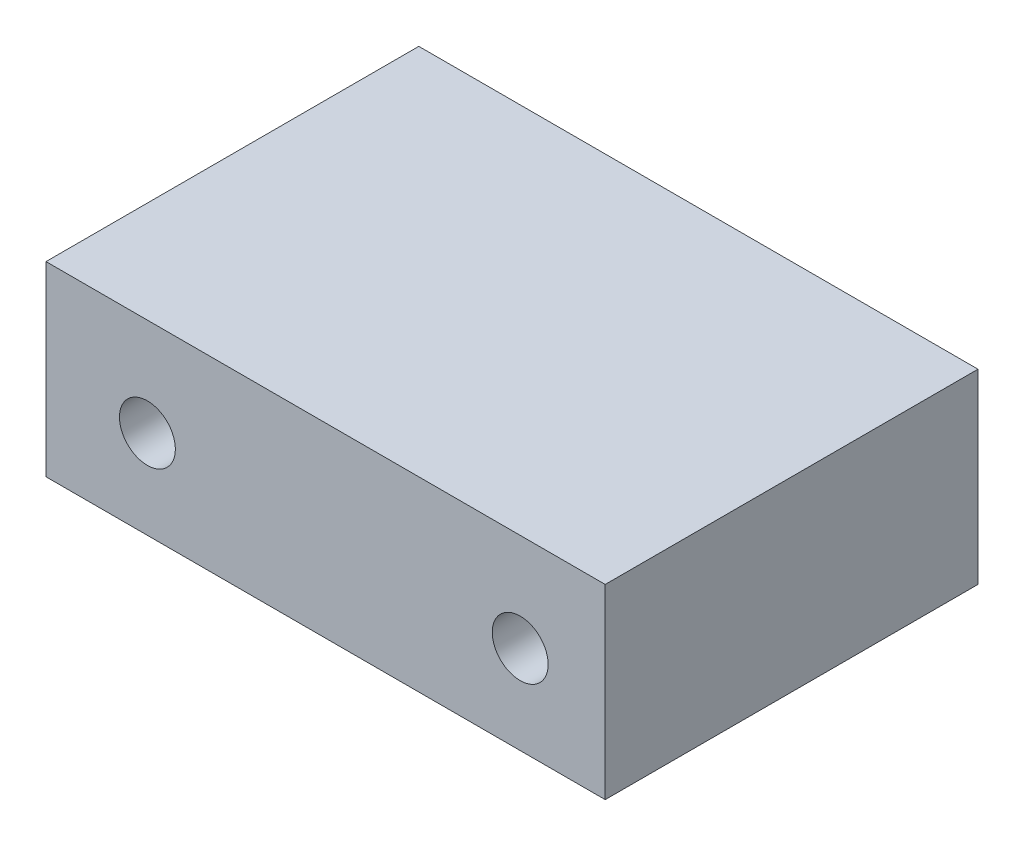
ISO-10303-21;
HEADER;
FILE_DESCRIPTION(('STEP AP214'),'2;1');
FILE_NAME('part.step','',(''),(''),'','','');
FILE_SCHEMA(('AUTOMOTIVE_DESIGN { 1 0 10303 214 1 1 1 1 }'));
ENDSEC;
DATA;
#1=APPLICATION_CONTEXT('core data for automotive mechanical design processes');
#2=APPLICATION_PROTOCOL_DEFINITION('international standard','automotive_design',2000,#1);
#3=PRODUCT_CONTEXT('',#1,'mechanical');
#4=PRODUCT('Part','Part','',(#3));
#5=PRODUCT_RELATED_PRODUCT_CATEGORY('part','',(#4));
#6=PRODUCT_DEFINITION_FORMATION('','',#4);
#7=PRODUCT_DEFINITION_CONTEXT('part definition',#1,'design');
#8=PRODUCT_DEFINITION('design','',#6,#7);
#9=PRODUCT_DEFINITION_SHAPE('','',#8);
#10=(LENGTH_UNIT() NAMED_UNIT(*) SI_UNIT(.MILLI.,.METRE.));
#11=(NAMED_UNIT(*) PLANE_ANGLE_UNIT() SI_UNIT($,.RADIAN.));
#12=(NAMED_UNIT(*) SI_UNIT($,.STERADIAN.) SOLID_ANGLE_UNIT());
#13=UNCERTAINTY_MEASURE_WITH_UNIT(LENGTH_MEASURE(1.E-05),#10,'distance_accuracy_value','');
#14=(GEOMETRIC_REPRESENTATION_CONTEXT(3) GLOBAL_UNCERTAINTY_ASSIGNED_CONTEXT((#13)) GLOBAL_UNIT_ASSIGNED_CONTEXT((#10,
#11,#12)) REPRESENTATION_CONTEXT('',''));
#15=CARTESIAN_POINT('',(0.,0.,0.));
#16=DIRECTION('',(0.,0.,1.));
#17=DIRECTION('',(1.,0.,0.));
#18=AXIS2_PLACEMENT_3D('',#15,#16,#17);
#19=CARTESIAN_POINT('',(15.,10.,10.));
#20=DIRECTION('',(-1.,0.,0.));
#21=DIRECTION('',(0.,0.,1.));
#22=AXIS2_PLACEMENT_3D('',#19,#20,#21);
#23=PLANE('',#22);
#24=DIRECTION('',(0.,0.,-1.));
#25=VECTOR('',#24,1.);
#26=CARTESIAN_POINT('',(15.,0.,10.));
#27=LINE('',#26,#25);
#28=CARTESIAN_POINT('',(15.,0.,10.));
#29=VERTEX_POINT('',#28);
#30=CARTESIAN_POINT('',(15.,0.,-10.));
#31=VERTEX_POINT('',#30);
#32=EDGE_CURVE('E111',#29,#31,#27,.T.);
#33=ORIENTED_EDGE('',*,*,#32,.T.);
#34=DIRECTION('',(0.,-1.,0.));
#35=VECTOR('',#34,1.);
#36=CARTESIAN_POINT('',(15.,10.,-10.));
#37=LINE('',#36,#35);
#38=CARTESIAN_POINT('',(15.,10.,-10.));
#39=VERTEX_POINT('',#38);
#40=EDGE_CURVE('E11',#39,#31,#37,.T.);
#41=ORIENTED_EDGE('',*,*,#40,.F.);
#42=DIRECTION('',(0.,0.,-1.));
#43=VECTOR('',#42,1.);
#44=CARTESIAN_POINT('',(15.,10.,10.));
#45=LINE('',#44,#43);
#46=CARTESIAN_POINT('',(15.,10.,10.));
#47=VERTEX_POINT('',#46);
#48=EDGE_CURVE('E95',#47,#39,#45,.T.);
#49=ORIENTED_EDGE('',*,*,#48,.F.);
#50=DIRECTION('',(0.,-1.,0.));
#51=VECTOR('',#50,1.);
#52=CARTESIAN_POINT('',(15.,10.,10.));
#53=LINE('',#52,#51);
#54=EDGE_CURVE('E107',#47,#29,#53,.T.);
#55=ORIENTED_EDGE('',*,*,#54,.T.);
#56=EDGE_LOOP('',(#33,#41,#49,#55));
#57=FACE_BOUND('',#56,.T.);
#58=ADVANCED_FACE('F43',(#57),#23,.F.);
#59=CARTESIAN_POINT('',(-15.,10.,-10.));
#60=DIRECTION('',(0.,0.,1.));
#61=DIRECTION('',(1.,0.,0.));
#62=AXIS2_PLACEMENT_3D('',#59,#60,#61);
#63=PLANE('',#62);
#64=CARTESIAN_POINT('',(-9.56010316882996,4.75000000000004,-10.));
#65=DIRECTION('',(0.,0.,1.));
#66=DIRECTION('',(1.,0.,0.));
#67=AXIS2_PLACEMENT_3D('',#64,#65,#66);
#68=CIRCLE('',#67,1.5);
#69=CARTESIAN_POINT('',(-8.06010316882996,4.75000000000004,-10.));
#70=VERTEX_POINT('',#69);
#71=EDGE_CURVE('E115',#70,#70,#68,.T.);
#72=ORIENTED_EDGE('',*,*,#71,.T.);
#73=EDGE_LOOP('',(#72));
#74=FACE_BOUND('',#73,.T.);
#75=CARTESIAN_POINT('',(10.43989683117,4.75000000000005,-10.));
#76=DIRECTION('',(0.,0.,1.));
#77=DIRECTION('',(1.,0.,0.));
#78=AXIS2_PLACEMENT_3D('',#75,#76,#77);
#79=CIRCLE('',#78,1.5);
#80=CARTESIAN_POINT('',(11.93989683117,4.75000000000005,-10.));
#81=VERTEX_POINT('',#80);
#82=EDGE_CURVE('E135',#81,#81,#79,.T.);
#83=ORIENTED_EDGE('',*,*,#82,.T.);
#84=EDGE_LOOP('',(#83));
#85=FACE_BOUND('',#84,.T.);
#86=DIRECTION('',(-1.,0.,0.));
#87=VECTOR('',#86,1.);
#88=CARTESIAN_POINT('',(-15.,0.,-10.));
#89=LINE('',#88,#87);
#90=CARTESIAN_POINT('',(-15.,0.,-10.));
#91=VERTEX_POINT('',#90);
#92=EDGE_CURVE('E100',#31,#91,#89,.T.);
#93=ORIENTED_EDGE('',*,*,#92,.T.);
#94=DIRECTION('',(0.,-1.,0.));
#95=VECTOR('',#94,1.);
#96=CARTESIAN_POINT('',(-15.,10.,-10.));
#97=LINE('',#96,#95);
#98=CARTESIAN_POINT('',(-15.,10.,-10.));
#99=VERTEX_POINT('',#98);
#100=EDGE_CURVE('E52',#99,#91,#97,.T.);
#101=ORIENTED_EDGE('',*,*,#100,.F.);
#102=DIRECTION('',(-1.,0.,0.));
#103=VECTOR('',#102,1.);
#104=CARTESIAN_POINT('',(-15.,10.,-10.));
#105=LINE('',#104,#103);
#106=EDGE_CURVE('E90',#39,#99,#105,.T.);
#107=ORIENTED_EDGE('',*,*,#106,.F.);
#108=ORIENTED_EDGE('',*,*,#40,.T.);
#109=EDGE_LOOP('',(#93,#101,#107,#108));
#110=FACE_BOUND('',#109,.T.);
#111=ADVANCED_FACE('F99',(#74,#85,#110),#63,.F.);
#112=CARTESIAN_POINT('',(-15.,10.,10.));
#113=DIRECTION('',(1.,0.,0.));
#114=DIRECTION('',(0.,0.,-1.));
#115=AXIS2_PLACEMENT_3D('',#112,#113,#114);
#116=PLANE('',#115);
#117=DIRECTION('',(0.,0.,1.));
#118=VECTOR('',#117,1.);
#119=CARTESIAN_POINT('',(-15.,0.,10.));
#120=LINE('',#119,#118);
#121=CARTESIAN_POINT('',(-15.,0.,10.));
#122=VERTEX_POINT('',#121);
#123=EDGE_CURVE('E77',#91,#122,#120,.T.);
#124=ORIENTED_EDGE('',*,*,#123,.T.);
#125=DIRECTION('',(0.,-1.,0.));
#126=VECTOR('',#125,1.);
#127=CARTESIAN_POINT('',(-15.,10.,10.));
#128=LINE('',#127,#126);
#129=CARTESIAN_POINT('',(-15.,10.,10.));
#130=VERTEX_POINT('',#129);
#131=EDGE_CURVE('E102',#130,#122,#128,.T.);
#132=ORIENTED_EDGE('',*,*,#131,.F.);
#133=DIRECTION('',(0.,0.,1.));
#134=VECTOR('',#133,1.);
#135=CARTESIAN_POINT('',(-15.,10.,10.));
#136=LINE('',#135,#134);
#137=EDGE_CURVE('E93',#99,#130,#136,.T.);
#138=ORIENTED_EDGE('',*,*,#137,.F.);
#139=ORIENTED_EDGE('',*,*,#100,.T.);
#140=EDGE_LOOP('',(#124,#132,#138,#139));
#141=FACE_BOUND('',#140,.T.);
#142=ADVANCED_FACE('F103',(#141),#116,.F.);
#143=CARTESIAN_POINT('',(-15.,10.,10.));
#144=DIRECTION('',(0.,0.,-1.));
#145=DIRECTION('',(-1.,0.,0.));
#146=AXIS2_PLACEMENT_3D('',#143,#144,#145);
#147=PLANE('',#146);
#148=CARTESIAN_POINT('',(-9.56010316882996,4.75000000000004,10.));
#149=DIRECTION('',(0.,0.,1.));
#150=DIRECTION('',(1.,0.,0.));
#151=AXIS2_PLACEMENT_3D('',#148,#149,#150);
#152=CIRCLE('',#151,1.5);
#153=CARTESIAN_POINT('',(-8.06010316882996,4.75000000000004,10.));
#154=VERTEX_POINT('',#153);
#155=EDGE_CURVE('E139',#154,#154,#152,.T.);
#156=ORIENTED_EDGE('',*,*,#155,.F.);
#157=EDGE_LOOP('',(#156));
#158=FACE_BOUND('',#157,.T.);
#159=CARTESIAN_POINT('',(10.43989683117,4.75000000000005,10.));
#160=DIRECTION('',(0.,0.,1.));
#161=DIRECTION('',(1.,0.,0.));
#162=AXIS2_PLACEMENT_3D('',#159,#160,#161);
#163=CIRCLE('',#162,1.5);
#164=CARTESIAN_POINT('',(11.93989683117,4.75000000000005,10.));
#165=VERTEX_POINT('',#164);
#166=EDGE_CURVE('E140',#165,#165,#163,.T.);
#167=ORIENTED_EDGE('',*,*,#166,.F.);
#168=EDGE_LOOP('',(#167));
#169=FACE_BOUND('',#168,.T.);
#170=DIRECTION('',(1.,0.,0.));
#171=VECTOR('',#170,1.);
#172=CARTESIAN_POINT('',(-15.,0.,10.));
#173=LINE('',#172,#171);
#174=EDGE_CURVE('E83',#122,#29,#173,.T.);
#175=ORIENTED_EDGE('',*,*,#174,.T.);
#176=ORIENTED_EDGE('',*,*,#54,.F.);
#177=DIRECTION('',(1.,0.,0.));
#178=VECTOR('',#177,1.);
#179=CARTESIAN_POINT('',(-15.,10.,10.));
#180=LINE('',#179,#178);
#181=EDGE_CURVE('E60',#130,#47,#180,.T.);
#182=ORIENTED_EDGE('',*,*,#181,.F.);
#183=ORIENTED_EDGE('',*,*,#131,.T.);
#184=EDGE_LOOP('',(#175,#176,#182,#183));
#185=FACE_BOUND('',#184,.T.);
#186=ADVANCED_FACE('F125',(#158,#169,#185),#147,.F.);
#187=CARTESIAN_POINT('',(0.,10.,0.));
#188=DIRECTION('',(0.,-1.,0.));
#189=DIRECTION('',(0.,0.,-1.));
#190=AXIS2_PLACEMENT_3D('',#187,#188,#189);
#191=PLANE('',#190);
#192=ORIENTED_EDGE('',*,*,#48,.T.);
#193=ORIENTED_EDGE('',*,*,#106,.T.);
#194=ORIENTED_EDGE('',*,*,#137,.T.);
#195=ORIENTED_EDGE('',*,*,#181,.T.);
#196=EDGE_LOOP('',(#192,#193,#194,#195));
#197=FACE_BOUND('',#196,.T.);
#198=ADVANCED_FACE('F91',(#197),#191,.F.);
#199=CARTESIAN_POINT('',(0.,0.,0.));
#200=DIRECTION('',(0.,-1.,0.));
#201=DIRECTION('',(0.,0.,-1.));
#202=AXIS2_PLACEMENT_3D('',#199,#200,#201);
#203=PLANE('',#202);
#204=ORIENTED_EDGE('',*,*,#32,.F.);
#205=ORIENTED_EDGE('',*,*,#174,.F.);
#206=ORIENTED_EDGE('',*,*,#123,.F.);
#207=ORIENTED_EDGE('',*,*,#92,.F.);
#208=EDGE_LOOP('',(#204,#205,#206,#207));
#209=FACE_BOUND('',#208,.T.);
#210=ADVANCED_FACE('F128',(#209),#203,.T.);
#211=CARTESIAN_POINT('',(10.43989683117,4.75000000000005,-15.));
#212=DIRECTION('',(0.,0.,1.));
#213=DIRECTION('',(1.,0.,0.));
#214=AXIS2_PLACEMENT_3D('',#211,#212,#213);
#215=CYLINDRICAL_SURFACE('',#214,1.5);
#216=ORIENTED_EDGE('',*,*,#166,.T.);
#217=EDGE_LOOP('',(#216));
#218=FACE_BOUND('',#217,.T.);
#219=ORIENTED_EDGE('',*,*,#82,.F.);
#220=EDGE_LOOP('',(#219));
#221=FACE_BOUND('',#220,.T.);
#222=ADVANCED_FACE('F156',(#218,#221),#215,.F.);
#223=CARTESIAN_POINT('',(-9.56010316882996,4.75000000000004,-15.));
#224=DIRECTION('',(0.,0.,1.));
#225=DIRECTION('',(1.,0.,0.));
#226=AXIS2_PLACEMENT_3D('',#223,#224,#225);
#227=CYLINDRICAL_SURFACE('',#226,1.5);
#228=ORIENTED_EDGE('',*,*,#155,.T.);
#229=EDGE_LOOP('',(#228));
#230=FACE_BOUND('',#229,.T.);
#231=ORIENTED_EDGE('',*,*,#71,.F.);
#232=EDGE_LOOP('',(#231));
#233=FACE_BOUND('',#232,.T.);
#234=ADVANCED_FACE('F148',(#230,#233),#227,.F.);
#235=CLOSED_SHELL('',(#58,#111,#142,#186,#198,#210,#222,#234));
#236=MANIFOLD_SOLID_BREP('B2',#235);
#237=ADVANCED_BREP_SHAPE_REPRESENTATION('',(#18,#236),#14);
#238=SHAPE_DEFINITION_REPRESENTATION(#9,#237);
ENDSEC;
END-ISO-10303-21;
